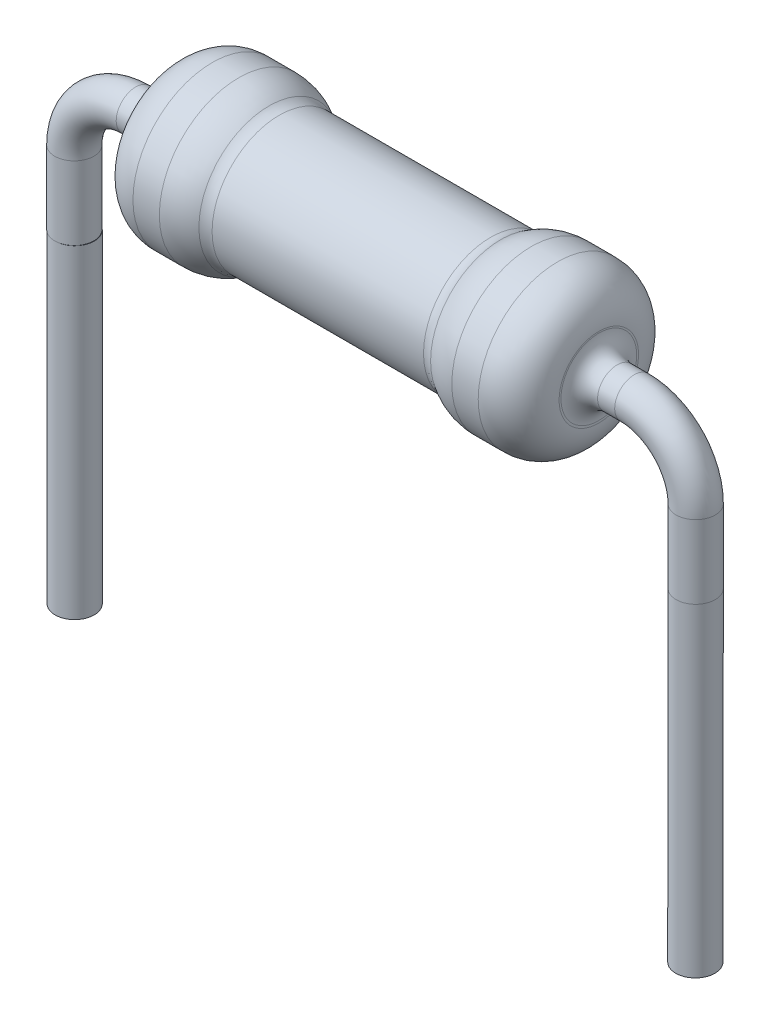
ISO-10303-21;
HEADER;
FILE_DESCRIPTION(('STEP AP214'),'2;1');
FILE_NAME('part.step','',(''),(''),'','','');
FILE_SCHEMA(('AUTOMOTIVE_DESIGN { 1 0 10303 214 1 1 1 1 }'));
ENDSEC;
DATA;
#1=APPLICATION_CONTEXT('core data for automotive mechanical design processes');
#2=APPLICATION_PROTOCOL_DEFINITION('international standard','automotive_design',2000,#1);
#3=PRODUCT_CONTEXT('',#1,'mechanical');
#4=PRODUCT('Part','Part','',(#3));
#5=PRODUCT_RELATED_PRODUCT_CATEGORY('part','',(#4));
#6=PRODUCT_DEFINITION_FORMATION('','',#4);
#7=PRODUCT_DEFINITION_CONTEXT('part definition',#1,'design');
#8=PRODUCT_DEFINITION('design','',#6,#7);
#9=PRODUCT_DEFINITION_SHAPE('','',#8);
#10=(LENGTH_UNIT() NAMED_UNIT(*) SI_UNIT(.MILLI.,.METRE.));
#11=(NAMED_UNIT(*) PLANE_ANGLE_UNIT() SI_UNIT($,.RADIAN.));
#12=(NAMED_UNIT(*) SI_UNIT($,.STERADIAN.) SOLID_ANGLE_UNIT());
#13=UNCERTAINTY_MEASURE_WITH_UNIT(LENGTH_MEASURE(1.E-05),#10,'distance_accuracy_value','');
#14=(GEOMETRIC_REPRESENTATION_CONTEXT(3) GLOBAL_UNCERTAINTY_ASSIGNED_CONTEXT((#13)) GLOBAL_UNIT_ASSIGNED_CONTEXT((#10,
#11,#12)) REPRESENTATION_CONTEXT('',''));
#15=CARTESIAN_POINT('',(0.,0.,0.));
#16=DIRECTION('',(0.,0.,1.));
#17=DIRECTION('',(1.,0.,0.));
#18=AXIS2_PLACEMENT_3D('',#15,#16,#17);
#19=CARTESIAN_POINT('',(-3.5,0.,0.));
#20=DIRECTION('',(1.,0.,0.));
#21=DIRECTION('',(0.,0.,-1.));
#22=AXIS2_PLACEMENT_3D('',#19,#20,#21);
#23=PLANE('',#22);
#24=CARTESIAN_POINT('',(-3.5,7.50595401109108,0.));
#25=DIRECTION('',(1.,0.,0.));
#26=DIRECTION('',(0.,0.,-1.));
#27=AXIS2_PLACEMENT_3D('',#24,#25,#26);
#28=CIRCLE('',#27,0.62);
#29=CARTESIAN_POINT('',(-3.5,7.50595401109108,-0.62));
#30=VERTEX_POINT('',#29);
#31=EDGE_CURVE('E11',#30,#30,#28,.T.);
#32=ORIENTED_EDGE('',*,*,#31,.T.);
#33=EDGE_LOOP('',(#32));
#34=FACE_BOUND('',#33,.T.);
#35=CARTESIAN_POINT('',(-3.5,7.50030887078089,0.));
#36=DIRECTION('',(-1.,0.,0.));
#37=DIRECTION('',(0.,0.,1.));
#38=AXIS2_PLACEMENT_3D('',#35,#36,#37);
#39=CIRCLE('',#38,0.650453186138384);
#40=CARTESIAN_POINT('',(-3.5,7.50030887078089,0.650453186138384));
#41=VERTEX_POINT('',#40);
#42=EDGE_CURVE('E200',#41,#41,#39,.T.);
#43=ORIENTED_EDGE('',*,*,#42,.T.);
#44=EDGE_LOOP('',(#43));
#45=FACE_BOUND('',#44,.T.);
#46=ADVANCED_FACE('F42',(#34,#45),#23,.F.);
#47=CARTESIAN_POINT('',(5.08,5.3,0.));
#48=DIRECTION('',(0.,-1.,0.));
#49=DIRECTION('',(0.,0.,-1.));
#50=AXIS2_PLACEMENT_3D('',#47,#48,#49);
#51=CYLINDRICAL_SURFACE('',#50,0.32);
#52=CARTESIAN_POINT('',(5.08595401109108,5.3,0.));
#53=DIRECTION('',(0.,1.,0.));
#54=DIRECTION('',(0.,0.,1.));
#55=AXIS2_PLACEMENT_3D('',#52,#53,#54);
#56=CIRCLE('',#55,0.32);
#57=CARTESIAN_POINT('',(5.08595401109108,5.3,0.32));
#58=VERTEX_POINT('',#57);
#59=EDGE_CURVE('E62',#58,#58,#56,.T.);
#60=ORIENTED_EDGE('',*,*,#59,.F.);
#61=EDGE_LOOP('',(#60));
#62=FACE_BOUND('',#61,.T.);
#63=CARTESIAN_POINT('',(5.08,0.,0.));
#64=DIRECTION('',(0.,1.,0.));
#65=DIRECTION('',(0.,0.,-1.));
#66=AXIS2_PLACEMENT_3D('',#63,#64,#65);
#67=CIRCLE('',#66,0.32);
#68=CARTESIAN_POINT('',(5.08,0.,-0.319999999999999));
#69=VERTEX_POINT('',#68);
#70=EDGE_CURVE('E156',#69,#69,#67,.T.);
#71=ORIENTED_EDGE('',*,*,#70,.T.);
#72=EDGE_LOOP('',(#71));
#73=FACE_BOUND('',#72,.T.);
#74=ADVANCED_FACE('F69',(#62,#73),#51,.T.);
#75=CARTESIAN_POINT('',(5.08,0.,0.));
#76=DIRECTION('',(0.,-1.,0.));
#77=DIRECTION('',(0.,0.,-1.));
#78=AXIS2_PLACEMENT_3D('',#75,#76,#77);
#79=PLANE('',#78);
#80=ORIENTED_EDGE('',*,*,#70,.F.);
#81=EDGE_LOOP('',(#80));
#82=FACE_BOUND('',#81,.T.);
#83=ADVANCED_FACE('F78',(#82),#79,.T.);
#84=CARTESIAN_POINT('',(4.08,7.50595401109108,0.));
#85=DIRECTION('',(-1.,0.,0.));
#86=DIRECTION('',(0.,-1.,0.));
#87=AXIS2_PLACEMENT_3D('',#84,#85,#86);
#88=CYLINDRICAL_SURFACE('',#87,0.32);
#89=CARTESIAN_POINT('',(3.8,7.50595401109108,0.));
#90=DIRECTION('',(1.,0.,0.));
#91=DIRECTION('',(0.,0.,-1.));
#92=AXIS2_PLACEMENT_3D('',#89,#90,#91);
#93=CIRCLE('',#92,0.32);
#94=CARTESIAN_POINT('',(3.8,7.50595401109108,-0.32));
#95=VERTEX_POINT('',#94);
#96=EDGE_CURVE('E53',#95,#95,#93,.T.);
#97=ORIENTED_EDGE('',*,*,#96,.T.);
#98=EDGE_LOOP('',(#97));
#99=FACE_BOUND('',#98,.T.);
#100=CARTESIAN_POINT('',(4.08,7.50595401109108,0.));
#101=DIRECTION('',(-1.,0.,0.));
#102=DIRECTION('',(0.,0.,1.));
#103=AXIS2_PLACEMENT_3D('',#100,#101,#102);
#104=CIRCLE('',#103,0.32);
#105=CARTESIAN_POINT('',(4.08,7.82595401109108,0.));
#106=VERTEX_POINT('',#105);
#107=EDGE_CURVE('E163',#106,#106,#104,.T.);
#108=ORIENTED_EDGE('',*,*,#107,.T.);
#109=EDGE_LOOP('',(#108));
#110=FACE_BOUND('',#109,.T.);
#111=ADVANCED_FACE('F253',(#99,#110),#88,.T.);
#112=CARTESIAN_POINT('',(4.08,6.5,0.));
#113=DIRECTION('',(0.,0.,1.));
#114=DIRECTION('',(1.,0.,0.));
#115=AXIS2_PLACEMENT_3D('',#112,#113,#114);
#116=TOROIDAL_SURFACE('',#115,1.00595401109108,0.32);
#117=CARTESIAN_POINT('',(5.08595401109107,6.5,0.));
#118=DIRECTION('',(0.,1.,0.));
#119=DIRECTION('',(0.,0.,1.));
#120=AXIS2_PLACEMENT_3D('',#117,#118,#119);
#121=CIRCLE('',#120,0.32);
#122=CARTESIAN_POINT('',(5.40595401109108,6.5,0.));
#123=VERTEX_POINT('',#122);
#124=EDGE_CURVE('E167',#123,#123,#121,.T.);
#125=CARTESIAN_POINT('',(4.08,6.5,0.));
#126=DIRECTION('',(0.,0.,1.));
#127=DIRECTION('',(1.,0.,0.));
#128=AXIS2_PLACEMENT_3D('',#125,#126,#127);
#129=CIRCLE('',#128,1.32595401109108);
#130=EDGE_CURVE('',#123,#106,#129,.T.);
#131=ORIENTED_EDGE('',*,*,#124,.T.);
#132=ORIENTED_EDGE('',*,*,#107,.F.);
#133=ORIENTED_EDGE('',*,*,#130,.T.);
#134=ORIENTED_EDGE('',*,*,#130,.F.);
#135=EDGE_LOOP('',(#131,#133,#132,#134));
#136=FACE_BOUND('',#135,.T.);
#137=ADVANCED_FACE('F148',(#136),#116,.T.);
#138=CARTESIAN_POINT('',(5.08595401109107,6.5,0.));
#139=DIRECTION('',(0.,-1.,0.));
#140=DIRECTION('',(1.,0.,0.));
#141=AXIS2_PLACEMENT_3D('',#138,#139,#140);
#142=CYLINDRICAL_SURFACE('',#141,0.32);
#143=ORIENTED_EDGE('',*,*,#124,.F.);
#144=EDGE_LOOP('',(#143));
#145=FACE_BOUND('',#144,.T.);
#146=ORIENTED_EDGE('',*,*,#59,.T.);
#147=EDGE_LOOP('',(#146));
#148=FACE_BOUND('',#147,.T.);
#149=ADVANCED_FACE('F143',(#145,#148),#142,.T.);
#150=CARTESIAN_POINT('',(3.5,0.,0.));
#151=DIRECTION('',(1.,0.,0.));
#152=DIRECTION('',(0.,0.,-1.));
#153=AXIS2_PLACEMENT_3D('',#150,#151,#152);
#154=PLANE('',#153);
#155=CARTESIAN_POINT('',(3.5,7.50595401109108,0.));
#156=DIRECTION('',(1.,0.,0.));
#157=DIRECTION('',(0.,0.,-1.));
#158=AXIS2_PLACEMENT_3D('',#155,#156,#157);
#159=CIRCLE('',#158,0.62);
#160=CARTESIAN_POINT('',(3.5,7.50595401109108,-0.62));
#161=VERTEX_POINT('',#160);
#162=EDGE_CURVE('E57',#161,#161,#159,.F.);
#163=ORIENTED_EDGE('',*,*,#162,.T.);
#164=EDGE_LOOP('',(#163));
#165=FACE_BOUND('',#164,.T.);
#166=CARTESIAN_POINT('',(3.5,7.50030887078089,0.));
#167=DIRECTION('',(-1.,0.,0.));
#168=DIRECTION('',(0.,0.,1.));
#169=AXIS2_PLACEMENT_3D('',#166,#167,#168);
#170=CIRCLE('',#169,0.650453186138384);
#171=CARTESIAN_POINT('',(3.5,7.50030887078089,0.650453186138384));
#172=VERTEX_POINT('',#171);
#173=EDGE_CURVE('E171',#172,#172,#170,.T.);
#174=ORIENTED_EDGE('',*,*,#173,.F.);
#175=EDGE_LOOP('',(#174));
#176=FACE_BOUND('',#175,.T.);
#177=ADVANCED_FACE('F139',(#165,#176),#154,.T.);
#178=CARTESIAN_POINT('',(2.85,7.50030887078089,0.));
#179=DIRECTION('',(-1.,0.,0.));
#180=DIRECTION('',(0.,0.,1.));
#181=AXIS2_PLACEMENT_3D('',#178,#179,#180);
#182=TOROIDAL_SURFACE('',#181,0.650453186138384,0.65);
#183=CARTESIAN_POINT('',(2.82573198396603,7.50030887078089,0.));
#184=DIRECTION('',(-1.,0.,0.));
#185=DIRECTION('',(0.,0.,1.));
#186=AXIS2_PLACEMENT_3D('',#183,#184,#185);
#187=CIRCLE('',#186,1.3);
#188=CARTESIAN_POINT('',(2.82573198396603,7.50030887078089,1.3));
#189=VERTEX_POINT('',#188);
#190=EDGE_CURVE('E176',#189,#189,#187,.T.);
#191=ORIENTED_EDGE('',*,*,#190,.F.);
#192=EDGE_LOOP('',(#191));
#193=FACE_BOUND('',#192,.T.);
#194=ORIENTED_EDGE('',*,*,#173,.T.);
#195=EDGE_LOOP('',(#194));
#196=FACE_BOUND('',#195,.T.);
#197=ADVANCED_FACE('F135',(#193,#196),#182,.T.);
#198=CARTESIAN_POINT('',(-3.5,7.50030887078089,0.));
#199=DIRECTION('',(-1.,0.,0.));
#200=DIRECTION('',(0.,0.,1.));
#201=AXIS2_PLACEMENT_3D('',#198,#199,#200);
#202=CYLINDRICAL_SURFACE('',#201,1.3);
#203=ORIENTED_EDGE('',*,*,#190,.T.);
#204=EDGE_LOOP('',(#203));
#205=FACE_BOUND('',#204,.T.);
#206=CARTESIAN_POINT('',(2.39370640790275,7.50030887078089,0.));
#207=DIRECTION('',(-1.,0.,0.));
#208=DIRECTION('',(0.,0.,1.));
#209=AXIS2_PLACEMENT_3D('',#206,#207,#208);
#210=CIRCLE('',#209,1.3);
#211=CARTESIAN_POINT('',(2.39370640790275,7.50030887078089,1.3));
#212=VERTEX_POINT('',#211);
#213=EDGE_CURVE('E179',#212,#212,#210,.T.);
#214=ORIENTED_EDGE('',*,*,#213,.F.);
#215=EDGE_LOOP('',(#214));
#216=FACE_BOUND('',#215,.T.);
#217=ADVANCED_FACE('F131',(#205,#216),#202,.T.);
#218=CARTESIAN_POINT('',(2.39370640790275,7.50030887078089,0.));
#219=DIRECTION('',(-1.,0.,0.));
#220=DIRECTION('',(0.,0.,1.));
#221=AXIS2_PLACEMENT_3D('',#218,#219,#220);
#222=DEGENERATE_TOROIDAL_SURFACE('',#221,0.4,0.899999999999999,.T.);
#223=CARTESIAN_POINT('',(1.89621268934944,7.50030887078089,0.));
#224=DIRECTION('',(-1.,0.,0.));
#225=DIRECTION('',(0.,0.,1.));
#226=AXIS2_PLACEMENT_3D('',#223,#224,#225);
#227=CIRCLE('',#226,1.15);
#228=CARTESIAN_POINT('',(1.89621268934944,7.50030887078089,1.15));
#229=VERTEX_POINT('',#228);
#230=EDGE_CURVE('E182',#229,#229,#227,.T.);
#231=ORIENTED_EDGE('',*,*,#230,.F.);
#232=EDGE_LOOP('',(#231));
#233=FACE_BOUND('',#232,.T.);
#234=ORIENTED_EDGE('',*,*,#213,.T.);
#235=EDGE_LOOP('',(#234));
#236=FACE_BOUND('',#235,.T.);
#237=ADVANCED_FACE('F127',(#233,#236),#222,.T.);
#238=CARTESIAN_POINT('',(1.73038144983167,7.50030887078089,0.));
#239=DIRECTION('',(-1.,0.,0.));
#240=DIRECTION('',(0.,0.,1.));
#241=AXIS2_PLACEMENT_3D('',#238,#239,#240);
#242=TOROIDAL_SURFACE('',#241,1.4,0.3);
#243=ORIENTED_EDGE('',*,*,#230,.T.);
#244=EDGE_LOOP('',(#243));
#245=FACE_BOUND('',#244,.T.);
#246=CARTESIAN_POINT('',(1.73038144983167,7.50030887078089,0.));
#247=DIRECTION('',(-1.,0.,0.));
#248=DIRECTION('',(0.,0.,1.));
#249=AXIS2_PLACEMENT_3D('',#246,#247,#248);
#250=CIRCLE('',#249,1.1);
#251=CARTESIAN_POINT('',(1.73038144983167,7.50030887078089,1.1));
#252=VERTEX_POINT('',#251);
#253=EDGE_CURVE('E185',#252,#252,#250,.T.);
#254=ORIENTED_EDGE('',*,*,#253,.F.);
#255=EDGE_LOOP('',(#254));
#256=FACE_BOUND('',#255,.T.);
#257=ADVANCED_FACE('F123',(#245,#256),#242,.F.);
#258=CARTESIAN_POINT('',(-3.5,7.50030887078089,0.));
#259=DIRECTION('',(-1.,0.,0.));
#260=DIRECTION('',(0.,0.,1.));
#261=AXIS2_PLACEMENT_3D('',#258,#259,#260);
#262=CYLINDRICAL_SURFACE('',#261,1.1);
#263=ORIENTED_EDGE('',*,*,#253,.T.);
#264=EDGE_LOOP('',(#263));
#265=FACE_BOUND('',#264,.T.);
#266=CARTESIAN_POINT('',(-1.73038144983167,7.50030887078089,0.));
#267=DIRECTION('',(-1.,0.,0.));
#268=DIRECTION('',(0.,0.,1.));
#269=AXIS2_PLACEMENT_3D('',#266,#267,#268);
#270=CIRCLE('',#269,1.1);
#271=CARTESIAN_POINT('',(-1.73038144983167,7.50030887078089,1.1));
#272=VERTEX_POINT('',#271);
#273=EDGE_CURVE('E188',#272,#272,#270,.T.);
#274=ORIENTED_EDGE('',*,*,#273,.F.);
#275=EDGE_LOOP('',(#274));
#276=FACE_BOUND('',#275,.T.);
#277=ADVANCED_FACE('F119',(#265,#276),#262,.T.);
#278=CARTESIAN_POINT('',(-1.73038144983167,7.50030887078089,0.));
#279=DIRECTION('',(-1.,0.,0.));
#280=DIRECTION('',(0.,0.,1.));
#281=AXIS2_PLACEMENT_3D('',#278,#279,#280);
#282=TOROIDAL_SURFACE('',#281,1.4,0.3);
#283=CARTESIAN_POINT('',(-1.89621268934944,7.50030887078089,0.));
#284=DIRECTION('',(-1.,0.,0.));
#285=DIRECTION('',(0.,0.,1.));
#286=AXIS2_PLACEMENT_3D('',#283,#284,#285);
#287=CIRCLE('',#286,1.15);
#288=CARTESIAN_POINT('',(-1.89621268934944,7.50030887078089,1.15));
#289=VERTEX_POINT('',#288);
#290=EDGE_CURVE('E191',#289,#289,#287,.T.);
#291=ORIENTED_EDGE('',*,*,#290,.F.);
#292=EDGE_LOOP('',(#291));
#293=FACE_BOUND('',#292,.T.);
#294=ORIENTED_EDGE('',*,*,#273,.T.);
#295=EDGE_LOOP('',(#294));
#296=FACE_BOUND('',#295,.T.);
#297=ADVANCED_FACE('F115',(#293,#296),#282,.F.);
#298=CARTESIAN_POINT('',(-2.39370640790275,7.50030887078089,0.));
#299=DIRECTION('',(-1.,0.,0.));
#300=DIRECTION('',(0.,0.,1.));
#301=AXIS2_PLACEMENT_3D('',#298,#299,#300);
#302=DEGENERATE_TOROIDAL_SURFACE('',#301,0.4,0.899999999999999,.T.);
#303=ORIENTED_EDGE('',*,*,#290,.T.);
#304=EDGE_LOOP('',(#303));
#305=FACE_BOUND('',#304,.T.);
#306=CARTESIAN_POINT('',(-2.39370640790275,7.50030887078089,0.));
#307=DIRECTION('',(-1.,0.,0.));
#308=DIRECTION('',(0.,0.,1.));
#309=AXIS2_PLACEMENT_3D('',#306,#307,#308);
#310=CIRCLE('',#309,1.3);
#311=CARTESIAN_POINT('',(-2.39370640790275,7.50030887078089,1.3));
#312=VERTEX_POINT('',#311);
#313=EDGE_CURVE('E194',#312,#312,#310,.T.);
#314=ORIENTED_EDGE('',*,*,#313,.F.);
#315=EDGE_LOOP('',(#314));
#316=FACE_BOUND('',#315,.T.);
#317=ADVANCED_FACE('F111',(#305,#316),#302,.T.);
#318=CARTESIAN_POINT('',(-3.5,7.50030887078089,0.));
#319=DIRECTION('',(-1.,0.,0.));
#320=DIRECTION('',(0.,0.,1.));
#321=AXIS2_PLACEMENT_3D('',#318,#319,#320);
#322=CYLINDRICAL_SURFACE('',#321,1.3);
#323=ORIENTED_EDGE('',*,*,#313,.T.);
#324=EDGE_LOOP('',(#323));
#325=FACE_BOUND('',#324,.T.);
#326=CARTESIAN_POINT('',(-2.82573198396603,7.50030887078089,0.));
#327=DIRECTION('',(-1.,0.,0.));
#328=DIRECTION('',(0.,0.,1.));
#329=AXIS2_PLACEMENT_3D('',#326,#327,#328);
#330=CIRCLE('',#329,1.3);
#331=CARTESIAN_POINT('',(-2.82573198396603,7.50030887078089,1.3));
#332=VERTEX_POINT('',#331);
#333=EDGE_CURVE('E197',#332,#332,#330,.T.);
#334=ORIENTED_EDGE('',*,*,#333,.F.);
#335=EDGE_LOOP('',(#334));
#336=FACE_BOUND('',#335,.T.);
#337=ADVANCED_FACE('F107',(#325,#336),#322,.T.);
#338=CARTESIAN_POINT('',(-2.85,7.50030887078089,0.));
#339=DIRECTION('',(-1.,0.,0.));
#340=DIRECTION('',(0.,0.,1.));
#341=AXIS2_PLACEMENT_3D('',#338,#339,#340);
#342=TOROIDAL_SURFACE('',#341,0.650453186138384,0.65);
#343=ORIENTED_EDGE('',*,*,#333,.T.);
#344=EDGE_LOOP('',(#343));
#345=FACE_BOUND('',#344,.T.);
#346=ORIENTED_EDGE('',*,*,#42,.F.);
#347=EDGE_LOOP('',(#346));
#348=FACE_BOUND('',#347,.T.);
#349=ADVANCED_FACE('F104',(#345,#348),#342,.T.);
#350=CARTESIAN_POINT('',(-4.08,7.50595401109108,0.));
#351=DIRECTION('',(1.,0.,0.));
#352=DIRECTION('',(0.,1.,0.));
#353=AXIS2_PLACEMENT_3D('',#350,#351,#352);
#354=CYLINDRICAL_SURFACE('',#353,0.32);
#355=CARTESIAN_POINT('',(-3.8,7.50595401109108,0.));
#356=DIRECTION('',(1.,0.,0.));
#357=DIRECTION('',(0.,0.,-1.));
#358=AXIS2_PLACEMENT_3D('',#355,#356,#357);
#359=CIRCLE('',#358,0.32);
#360=CARTESIAN_POINT('',(-3.8,7.50595401109108,-0.32));
#361=VERTEX_POINT('',#360);
#362=EDGE_CURVE('E49',#361,#361,#359,.F.);
#363=ORIENTED_EDGE('',*,*,#362,.T.);
#364=EDGE_LOOP('',(#363));
#365=FACE_BOUND('',#364,.T.);
#366=CARTESIAN_POINT('',(-4.08,7.50595401109108,0.));
#367=DIRECTION('',(-1.,0.,0.));
#368=DIRECTION('',(0.,0.,1.));
#369=AXIS2_PLACEMENT_3D('',#366,#367,#368);
#370=CIRCLE('',#369,0.32);
#371=CARTESIAN_POINT('',(-4.08,7.82595401109108,0.));
#372=VERTEX_POINT('',#371);
#373=EDGE_CURVE('E203',#372,#372,#370,.T.);
#374=ORIENTED_EDGE('',*,*,#373,.F.);
#375=EDGE_LOOP('',(#374));
#376=FACE_BOUND('',#375,.T.);
#377=ADVANCED_FACE('F102',(#365,#376),#354,.T.);
#378=CARTESIAN_POINT('',(-4.08,6.5,0.));
#379=DIRECTION('',(0.,0.,-1.));
#380=DIRECTION('',(-1.,0.,0.));
#381=AXIS2_PLACEMENT_3D('',#378,#379,#380);
#382=TOROIDAL_SURFACE('',#381,1.00595401109108,0.32);
#383=CARTESIAN_POINT('',(-5.08595401109107,6.5,0.));
#384=DIRECTION('',(0.,-1.,0.));
#385=DIRECTION('',(0.,0.,1.));
#386=AXIS2_PLACEMENT_3D('',#383,#384,#385);
#387=CIRCLE('',#386,0.32);
#388=CARTESIAN_POINT('',(-5.40595401109108,6.5,0.));
#389=VERTEX_POINT('',#388);
#390=EDGE_CURVE('E206',#389,#389,#387,.T.);
#391=CARTESIAN_POINT('',(-4.08,6.5,0.));
#392=DIRECTION('',(0.,0.,-1.));
#393=DIRECTION('',(-1.,0.,0.));
#394=AXIS2_PLACEMENT_3D('',#391,#392,#393);
#395=CIRCLE('',#394,1.32595401109108);
#396=EDGE_CURVE('',#389,#372,#395,.T.);
#397=ORIENTED_EDGE('',*,*,#390,.F.);
#398=ORIENTED_EDGE('',*,*,#373,.T.);
#399=ORIENTED_EDGE('',*,*,#396,.T.);
#400=ORIENTED_EDGE('',*,*,#396,.F.);
#401=EDGE_LOOP('',(#397,#399,#398,#400));
#402=FACE_BOUND('',#401,.T.);
#403=ADVANCED_FACE('F215',(#402),#382,.T.);
#404=CARTESIAN_POINT('',(-5.08595401109107,6.5,0.));
#405=DIRECTION('',(0.,-1.,0.));
#406=DIRECTION('',(1.,0.,0.));
#407=AXIS2_PLACEMENT_3D('',#404,#405,#406);
#408=CYLINDRICAL_SURFACE('',#407,0.32);
#409=ORIENTED_EDGE('',*,*,#390,.T.);
#410=EDGE_LOOP('',(#409));
#411=FACE_BOUND('',#410,.T.);
#412=CARTESIAN_POINT('',(-5.08595401109108,5.3,0.));
#413=DIRECTION('',(0.,-1.,0.));
#414=DIRECTION('',(0.,0.,1.));
#415=AXIS2_PLACEMENT_3D('',#412,#413,#414);
#416=CIRCLE('',#415,0.32);
#417=CARTESIAN_POINT('',(-5.08595401109108,5.3,0.32));
#418=VERTEX_POINT('',#417);
#419=EDGE_CURVE('E207',#418,#418,#416,.T.);
#420=ORIENTED_EDGE('',*,*,#419,.F.);
#421=EDGE_LOOP('',(#420));
#422=FACE_BOUND('',#421,.T.);
#423=ADVANCED_FACE('F90',(#411,#422),#408,.T.);
#424=CARTESIAN_POINT('',(-5.08595401109108,5.3,0.));
#425=DIRECTION('',(0.,1.,0.));
#426=DIRECTION('',(0.,0.,1.));
#427=AXIS2_PLACEMENT_3D('',#424,#425,#426);
#428=PLANE('',#427);
#429=ORIENTED_EDGE('',*,*,#419,.T.);
#430=EDGE_LOOP('',(#429));
#431=FACE_BOUND('',#430,.T.);
#432=ADVANCED_FACE('F83',(#431),#428,.F.);
#433=CARTESIAN_POINT('',(3.8,7.50595401109108,0.));
#434=DIRECTION('',(1.,0.,0.));
#435=DIRECTION('',(0.,0.,-1.));
#436=AXIS2_PLACEMENT_3D('',#433,#434,#435);
#437=TOROIDAL_SURFACE('',#436,0.62,0.3);
#438=ORIENTED_EDGE('',*,*,#96,.F.);
#439=EDGE_LOOP('',(#438));
#440=FACE_BOUND('',#439,.T.);
#441=ORIENTED_EDGE('',*,*,#162,.F.);
#442=EDGE_LOOP('',(#441));
#443=FACE_BOUND('',#442,.T.);
#444=ADVANCED_FACE('F81',(#440,#443),#437,.F.);
#445=CARTESIAN_POINT('',(-3.8,7.50595401109108,0.));
#446=DIRECTION('',(1.,0.,0.));
#447=DIRECTION('',(0.,0.,-1.));
#448=AXIS2_PLACEMENT_3D('',#445,#446,#447);
#449=TOROIDAL_SURFACE('',#448,0.62,0.3);
#450=ORIENTED_EDGE('',*,*,#31,.F.);
#451=EDGE_LOOP('',(#450));
#452=FACE_BOUND('',#451,.T.);
#453=ORIENTED_EDGE('',*,*,#362,.F.);
#454=EDGE_LOOP('',(#453));
#455=FACE_BOUND('',#454,.T.);
#456=ADVANCED_FACE('F44',(#452,#455),#449,.F.);
#457=CLOSED_SHELL('',(#46,#74,#83,#111,#137,#149,#177,#197,#217,#237,#257,#277,#297,#317,#337,
#349,#377,#403,#423,#432,#444,#456));
#458=MANIFOLD_SOLID_BREP('B2',#457);
#459=CARTESIAN_POINT('',(-5.08,5.3,0.));
#460=DIRECTION('',(0.,-1.,0.));
#461=DIRECTION('',(0.,0.,-1.));
#462=AXIS2_PLACEMENT_3D('',#459,#460,#461);
#463=CYLINDRICAL_SURFACE('',#462,0.32);
#464=CARTESIAN_POINT('',(-5.08,5.3,0.));
#465=DIRECTION('',(0.,1.,0.));
#466=DIRECTION('',(0.,0.,1.));
#467=AXIS2_PLACEMENT_3D('',#464,#465,#466);
#468=CIRCLE('',#467,0.32);
#469=CARTESIAN_POINT('',(-5.08,5.3,0.320000000000002));
#470=VERTEX_POINT('',#469);
#471=EDGE_CURVE('E41',#470,#470,#468,.T.);
#472=ORIENTED_EDGE('',*,*,#471,.F.);
#473=EDGE_LOOP('',(#472));
#474=FACE_BOUND('',#473,.T.);
#475=CARTESIAN_POINT('',(-5.08,0.,0.));
#476=DIRECTION('',(0.,1.,0.));
#477=DIRECTION('',(0.,0.,1.));
#478=AXIS2_PLACEMENT_3D('',#475,#476,#477);
#479=CIRCLE('',#478,0.32);
#480=CARTESIAN_POINT('',(-5.08,0.,0.320000000000002));
#481=VERTEX_POINT('',#480);
#482=EDGE_CURVE('E407',#481,#481,#479,.T.);
#483=ORIENTED_EDGE('',*,*,#482,.T.);
#484=EDGE_LOOP('',(#483));
#485=FACE_BOUND('',#484,.T.);
#486=ADVANCED_FACE('F404',(#474,#485),#463,.T.);
#487=CARTESIAN_POINT('',(-5.08,5.3,0.));
#488=DIRECTION('',(0.,1.,0.));
#489=DIRECTION('',(0.,0.,1.));
#490=AXIS2_PLACEMENT_3D('',#487,#488,#489);
#491=PLANE('',#490);
#492=ORIENTED_EDGE('',*,*,#471,.T.);
#493=EDGE_LOOP('',(#492));
#494=FACE_BOUND('',#493,.T.);
#495=ADVANCED_FACE('F419',(#494),#491,.T.);
#496=CARTESIAN_POINT('',(-5.08,0.,0.));
#497=DIRECTION('',(0.,1.,0.));
#498=DIRECTION('',(0.,0.,1.));
#499=AXIS2_PLACEMENT_3D('',#496,#497,#498);
#500=PLANE('',#499);
#501=ORIENTED_EDGE('',*,*,#482,.F.);
#502=EDGE_LOOP('',(#501));
#503=FACE_BOUND('',#502,.T.);
#504=ADVANCED_FACE('F417',(#503),#500,.F.);
#505=CLOSED_SHELL('',(#486,#495,#504));
#506=MANIFOLD_SOLID_BREP('B6',#505);
#507=ADVANCED_BREP_SHAPE_REPRESENTATION('',(#18,#458,#506),#14);
#508=SHAPE_DEFINITION_REPRESENTATION(#9,#507);
ENDSEC;
END-ISO-10303-21;
